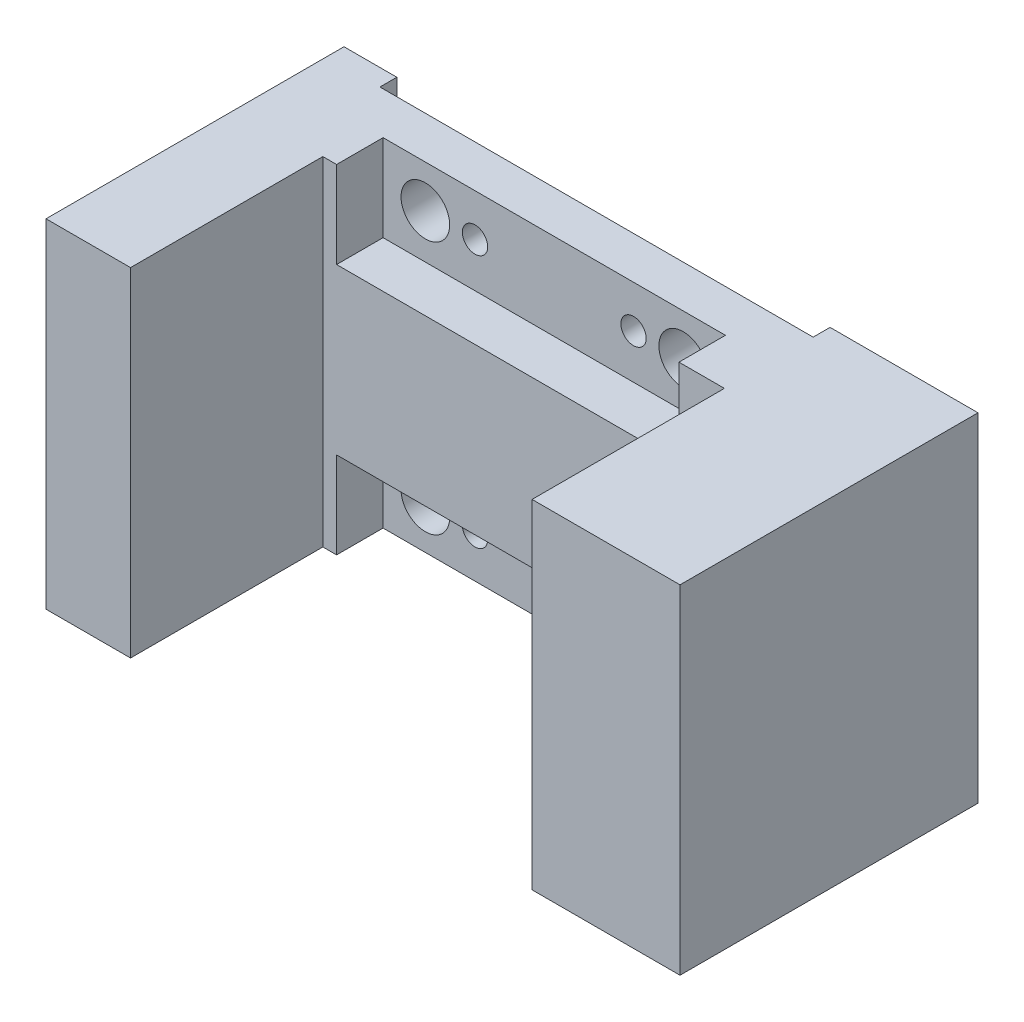
ISO-10303-21;
HEADER;
FILE_DESCRIPTION(('STEP AP214'),'2;1');
FILE_NAME('part.step','',(''),(''),'','','');
FILE_SCHEMA(('AUTOMOTIVE_DESIGN { 1 0 10303 214 1 1 1 1 }'));
ENDSEC;
DATA;
#1=APPLICATION_CONTEXT('core data for automotive mechanical design processes');
#2=APPLICATION_PROTOCOL_DEFINITION('international standard','automotive_design',2000,#1);
#3=PRODUCT_CONTEXT('',#1,'mechanical');
#4=PRODUCT('Part','Part','',(#3));
#5=PRODUCT_RELATED_PRODUCT_CATEGORY('part','',(#4));
#6=PRODUCT_DEFINITION_FORMATION('','',#4);
#7=PRODUCT_DEFINITION_CONTEXT('part definition',#1,'design');
#8=PRODUCT_DEFINITION('design','',#6,#7);
#9=PRODUCT_DEFINITION_SHAPE('','',#8);
#10=(LENGTH_UNIT() NAMED_UNIT(*) SI_UNIT(.MILLI.,.METRE.));
#11=(NAMED_UNIT(*) PLANE_ANGLE_UNIT() SI_UNIT($,.RADIAN.));
#12=(NAMED_UNIT(*) SI_UNIT($,.STERADIAN.) SOLID_ANGLE_UNIT());
#13=UNCERTAINTY_MEASURE_WITH_UNIT(LENGTH_MEASURE(1.E-05),#10,'distance_accuracy_value','');
#14=(GEOMETRIC_REPRESENTATION_CONTEXT(3) GLOBAL_UNCERTAINTY_ASSIGNED_CONTEXT((#13)) GLOBAL_UNIT_ASSIGNED_CONTEXT((#10,
#11,#12)) REPRESENTATION_CONTEXT('',''));
#15=CARTESIAN_POINT('',(0.,0.,0.));
#16=DIRECTION('',(0.,0.,1.));
#17=DIRECTION('',(1.,0.,0.));
#18=AXIS2_PLACEMENT_3D('',#15,#16,#17);
#19=CARTESIAN_POINT('',(13.2997289735968,0.736434108527126,5.8));
#20=DIRECTION('',(1.,0.,0.));
#21=DIRECTION('',(0.,0.,-1.));
#22=AXIS2_PLACEMENT_3D('',#19,#20,#21);
#23=PLANE('',#22);
#24=DIRECTION('',(0.,1.,0.));
#25=VECTOR('',#24,1.);
#26=CARTESIAN_POINT('',(13.2997289735968,0.736434108527122,2.8));
#27=LINE('',#26,#25);
#28=CARTESIAN_POINT('',(13.2997289735968,0.736434108527122,2.8));
#29=VERTEX_POINT('',#28);
#30=CARTESIAN_POINT('',(13.2997289735968,4.83643410852712,2.8));
#31=VERTEX_POINT('',#30);
#32=EDGE_CURVE('E185',#29,#31,#27,.T.);
#33=ORIENTED_EDGE('',*,*,#32,.F.);
#34=DIRECTION('',(0.,0.,-1.));
#35=VECTOR('',#34,1.);
#36=CARTESIAN_POINT('',(13.2997289735968,0.736434108527124,20.));
#37=LINE('',#36,#35);
#38=CARTESIAN_POINT('',(13.2997289735968,0.736434108527126,5.));
#39=VERTEX_POINT('',#38);
#40=EDGE_CURVE('E11',#39,#29,#37,.T.);
#41=ORIENTED_EDGE('',*,*,#40,.F.);
#42=DIRECTION('',(0.,1.,0.));
#43=VECTOR('',#42,1.);
#44=CARTESIAN_POINT('',(13.2997289735968,0.,5.));
#45=LINE('',#44,#43);
#46=CARTESIAN_POINT('',(13.2997289735968,4.83643410852712,5.));
#47=VERTEX_POINT('',#46);
#48=EDGE_CURVE('E358',#39,#47,#45,.T.);
#49=ORIENTED_EDGE('',*,*,#48,.T.);
#50=DIRECTION('',(0.,0.,-1.));
#51=VECTOR('',#50,1.);
#52=CARTESIAN_POINT('',(13.2997289735968,4.83643410852712,5.8));
#53=LINE('',#52,#51);
#54=EDGE_CURVE('E195',#47,#31,#53,.T.);
#55=ORIENTED_EDGE('',*,*,#54,.T.);
#56=EDGE_LOOP('',(#33,#41,#49,#55));
#57=FACE_BOUND('',#56,.T.);
#58=ADVANCED_FACE('F39',(#57),#23,.F.);
#59=CARTESIAN_POINT('',(-2.90027102640321,4.83643410852713,5.8));
#60=DIRECTION('',(0.,1.,0.));
#61=DIRECTION('',(-1.,0.,0.));
#62=AXIS2_PLACEMENT_3D('',#59,#60,#61);
#63=PLANE('',#62);
#64=DIRECTION('',(-1.,0.,0.));
#65=VECTOR('',#64,1.);
#66=CARTESIAN_POINT('',(-2.90027102640321,4.83643410852713,2.8));
#67=LINE('',#66,#65);
#68=CARTESIAN_POINT('',(-2.90027102640321,4.83643410852713,2.8));
#69=VERTEX_POINT('',#68);
#70=EDGE_CURVE('E189',#31,#69,#67,.T.);
#71=ORIENTED_EDGE('',*,*,#70,.F.);
#72=ORIENTED_EDGE('',*,*,#54,.F.);
#73=DIRECTION('',(-1.,0.,0.));
#74=VECTOR('',#73,1.);
#75=CARTESIAN_POINT('',(0.,4.83643410852713,5.));
#76=LINE('',#75,#74);
#77=CARTESIAN_POINT('',(-2.90027102640321,4.83643410852713,5.));
#78=VERTEX_POINT('',#77);
#79=EDGE_CURVE('E360',#47,#78,#76,.T.);
#80=ORIENTED_EDGE('',*,*,#79,.T.);
#81=DIRECTION('',(0.,0.,-1.));
#82=VECTOR('',#81,1.);
#83=CARTESIAN_POINT('',(-2.90027102640321,4.83643410852713,5.8));
#84=LINE('',#83,#82);
#85=EDGE_CURVE('E351',#78,#69,#84,.T.);
#86=ORIENTED_EDGE('',*,*,#85,.T.);
#87=EDGE_LOOP('',(#71,#72,#80,#86));
#88=FACE_BOUND('',#87,.T.);
#89=ADVANCED_FACE('F462',(#88),#63,.F.);
#90=CARTESIAN_POINT('',(-2.90027102640321,0.736434108527126,5.8));
#91=DIRECTION('',(-1.,0.,0.));
#92=DIRECTION('',(0.,-1.,0.));
#93=AXIS2_PLACEMENT_3D('',#90,#91,#92);
#94=PLANE('',#93);
#95=DIRECTION('',(0.,1.,0.));
#96=VECTOR('',#95,1.);
#97=CARTESIAN_POINT('',(-2.90027102640321,0.736434108527128,2.8));
#98=LINE('',#97,#96);
#99=CARTESIAN_POINT('',(-2.90027102640321,0.736434108527125,2.8));
#100=VERTEX_POINT('',#99);
#101=EDGE_CURVE('E56',#100,#69,#98,.T.);
#102=ORIENTED_EDGE('',*,*,#101,.T.);
#103=ORIENTED_EDGE('',*,*,#85,.F.);
#104=DIRECTION('',(0.,-1.,0.));
#105=VECTOR('',#104,1.);
#106=CARTESIAN_POINT('',(-2.90027102640321,0.,5.));
#107=LINE('',#106,#105);
#108=CARTESIAN_POINT('',(-2.90027102640321,0.736434108527125,5.));
#109=VERTEX_POINT('',#108);
#110=EDGE_CURVE('E353',#78,#109,#107,.T.);
#111=ORIENTED_EDGE('',*,*,#110,.T.);
#112=DIRECTION('',(0.,0.,1.));
#113=VECTOR('',#112,1.);
#114=CARTESIAN_POINT('',(-2.90027102640321,0.736434108527125,20.));
#115=LINE('',#114,#113);
#116=EDGE_CURVE('E48',#100,#109,#115,.T.);
#117=ORIENTED_EDGE('',*,*,#116,.F.);
#118=EDGE_LOOP('',(#102,#103,#111,#117));
#119=FACE_BOUND('',#118,.T.);
#120=ADVANCED_FACE('F466',(#119),#94,.F.);
#121=CARTESIAN_POINT('',(-2.90027102640321,16.7364341085271,5.8));
#122=DIRECTION('',(-1.,0.,0.));
#123=DIRECTION('',(0.,-1.,0.));
#124=AXIS2_PLACEMENT_3D('',#121,#122,#123);
#125=PLANE('',#124);
#126=DIRECTION('',(0.,-1.,0.));
#127=VECTOR('',#126,1.);
#128=CARTESIAN_POINT('',(-2.90027102640321,16.7364341085271,2.8));
#129=LINE('',#128,#127);
#130=CARTESIAN_POINT('',(-2.90027102640321,16.7364341085271,2.8));
#131=VERTEX_POINT('',#130);
#132=CARTESIAN_POINT('',(-2.90027102640321,12.6364341085271,2.8));
#133=VERTEX_POINT('',#132);
#134=EDGE_CURVE('E64',#131,#133,#129,.T.);
#135=ORIENTED_EDGE('',*,*,#134,.F.);
#136=DIRECTION('',(0.,0.,-1.));
#137=VECTOR('',#136,1.);
#138=CARTESIAN_POINT('',(-2.90027102640321,16.7364341085271,5.8));
#139=LINE('',#138,#137);
#140=CARTESIAN_POINT('',(-2.90027102640321,16.7364341085271,5.));
#141=VERTEX_POINT('',#140);
#142=EDGE_CURVE('E362',#141,#131,#139,.T.);
#143=ORIENTED_EDGE('',*,*,#142,.F.);
#144=DIRECTION('',(0.,-1.,0.));
#145=VECTOR('',#144,1.);
#146=CARTESIAN_POINT('',(-2.90027102640321,0.,5.));
#147=LINE('',#146,#145);
#148=CARTESIAN_POINT('',(-2.90027102640321,12.6364341085271,5.));
#149=VERTEX_POINT('',#148);
#150=EDGE_CURVE('E375',#141,#149,#147,.T.);
#151=ORIENTED_EDGE('',*,*,#150,.T.);
#152=DIRECTION('',(0.,0.,-1.));
#153=VECTOR('',#152,1.);
#154=CARTESIAN_POINT('',(-2.90027102640321,12.6364341085271,5.8));
#155=LINE('',#154,#153);
#156=EDGE_CURVE('E363',#149,#133,#155,.T.);
#157=ORIENTED_EDGE('',*,*,#156,.T.);
#158=EDGE_LOOP('',(#135,#143,#151,#157));
#159=FACE_BOUND('',#158,.T.);
#160=ADVANCED_FACE('F472',(#159),#125,.F.);
#161=CARTESIAN_POINT('',(-2.90027102640321,12.6364341085271,5.8));
#162=DIRECTION('',(0.,-1.,0.));
#163=DIRECTION('',(1.,0.,0.));
#164=AXIS2_PLACEMENT_3D('',#161,#162,#163);
#165=PLANE('',#164);
#166=DIRECTION('',(1.,0.,0.));
#167=VECTOR('',#166,1.);
#168=CARTESIAN_POINT('',(-2.90027102640321,12.6364341085271,2.8));
#169=LINE('',#168,#167);
#170=CARTESIAN_POINT('',(13.2997289735968,12.6364341085271,2.8));
#171=VERTEX_POINT('',#170);
#172=EDGE_CURVE('E196',#133,#171,#169,.T.);
#173=ORIENTED_EDGE('',*,*,#172,.F.);
#174=ORIENTED_EDGE('',*,*,#156,.F.);
#175=DIRECTION('',(1.,0.,0.));
#176=VECTOR('',#175,1.);
#177=CARTESIAN_POINT('',(0.,12.6364341085271,5.));
#178=LINE('',#177,#176);
#179=CARTESIAN_POINT('',(13.2997289735968,12.6364341085271,5.));
#180=VERTEX_POINT('',#179);
#181=EDGE_CURVE('E373',#149,#180,#178,.T.);
#182=ORIENTED_EDGE('',*,*,#181,.T.);
#183=DIRECTION('',(0.,0.,-1.));
#184=VECTOR('',#183,1.);
#185=CARTESIAN_POINT('',(13.2997289735968,12.6364341085271,5.8));
#186=LINE('',#185,#184);
#187=EDGE_CURVE('E366',#180,#171,#186,.T.);
#188=ORIENTED_EDGE('',*,*,#187,.T.);
#189=EDGE_LOOP('',(#173,#174,#182,#188));
#190=FACE_BOUND('',#189,.T.);
#191=ADVANCED_FACE('F444',(#190),#165,.F.);
#192=CARTESIAN_POINT('',(13.2997289735968,16.7364341085271,5.8));
#193=DIRECTION('',(1.,0.,0.));
#194=DIRECTION('',(0.,1.,0.));
#195=AXIS2_PLACEMENT_3D('',#192,#193,#194);
#196=PLANE('',#195);
#197=DIRECTION('',(0.,-1.,0.));
#198=VECTOR('',#197,1.);
#199=CARTESIAN_POINT('',(13.2997289735968,16.7364341085271,2.8));
#200=LINE('',#199,#198);
#201=CARTESIAN_POINT('',(13.2997289735968,16.7364341085271,2.8));
#202=VERTEX_POINT('',#201);
#203=EDGE_CURVE('E346',#202,#171,#200,.T.);
#204=ORIENTED_EDGE('',*,*,#203,.T.);
#205=ORIENTED_EDGE('',*,*,#187,.F.);
#206=DIRECTION('',(0.,1.,0.));
#207=VECTOR('',#206,1.);
#208=CARTESIAN_POINT('',(13.2997289735968,0.,5.));
#209=LINE('',#208,#207);
#210=CARTESIAN_POINT('',(13.2997289735968,16.7364341085271,5.));
#211=VERTEX_POINT('',#210);
#212=EDGE_CURVE('E365',#180,#211,#209,.T.);
#213=ORIENTED_EDGE('',*,*,#212,.T.);
#214=DIRECTION('',(0.,0.,-1.));
#215=VECTOR('',#214,1.);
#216=CARTESIAN_POINT('',(13.2997289735968,16.7364341085271,5.8));
#217=LINE('',#216,#215);
#218=EDGE_CURVE('E369',#211,#202,#217,.T.);
#219=ORIENTED_EDGE('',*,*,#218,.T.);
#220=EDGE_LOOP('',(#204,#205,#213,#219));
#221=FACE_BOUND('',#220,.T.);
#222=ADVANCED_FACE('F441',(#221),#196,.F.);
#223=CARTESIAN_POINT('',(0.,0.,0.));
#224=DIRECTION('',(0.,0.,1.));
#225=DIRECTION('',(1.,0.,0.));
#226=AXIS2_PLACEMENT_3D('',#223,#224,#225);
#227=PLANE('',#226);
#228=DIRECTION('',(1.,0.,0.));
#229=VECTOR('',#228,1.);
#230=CARTESIAN_POINT('',(-7.55027102640321,0.736434108527126,0.));
#231=LINE('',#230,#229);
#232=CARTESIAN_POINT('',(15.4497289735968,0.736434108527123,0.));
#233=VERTEX_POINT('',#232);
#234=CARTESIAN_POINT('',(22.4497289735968,0.736434108527122,0.));
#235=VERTEX_POINT('',#234);
#236=EDGE_CURVE('E383',#233,#235,#231,.T.);
#237=ORIENTED_EDGE('',*,*,#236,.F.);
#238=DIRECTION('',(0.,-1.,0.));
#239=VECTOR('',#238,1.);
#240=CARTESIAN_POINT('',(15.4497289735968,16.7364341085271,0.));
#241=LINE('',#240,#239);
#242=CARTESIAN_POINT('',(15.4497289735968,16.7364341085271,0.));
#243=VERTEX_POINT('',#242);
#244=EDGE_CURVE('E263',#243,#233,#241,.T.);
#245=ORIENTED_EDGE('',*,*,#244,.F.);
#246=DIRECTION('',(-1.,0.,0.));
#247=VECTOR('',#246,1.);
#248=CARTESIAN_POINT('',(-7.55027102640321,16.7364341085271,0.));
#249=LINE('',#248,#247);
#250=CARTESIAN_POINT('',(22.4497289735968,16.7364341085271,0.));
#251=VERTEX_POINT('',#250);
#252=EDGE_CURVE('E282',#251,#243,#249,.T.);
#253=ORIENTED_EDGE('',*,*,#252,.F.);
#254=DIRECTION('',(0.,1.,0.));
#255=VECTOR('',#254,1.);
#256=CARTESIAN_POINT('',(22.4497289735968,16.7364341085271,0.));
#257=LINE('',#256,#255);
#258=EDGE_CURVE('E279',#235,#251,#257,.T.);
#259=ORIENTED_EDGE('',*,*,#258,.F.);
#260=EDGE_LOOP('',(#237,#245,#253,#259));
#261=FACE_BOUND('',#260,.T.);
#262=ADVANCED_FACE('F419',(#261),#227,.F.);
#263=CARTESIAN_POINT('',(0.,0.,5.));
#264=DIRECTION('',(0.,0.,1.));
#265=DIRECTION('',(1.,0.,0.));
#266=AXIS2_PLACEMENT_3D('',#263,#264,#265);
#267=PLANE('',#266);
#268=ORIENTED_EDGE('',*,*,#48,.F.);
#269=DIRECTION('',(-1.,0.,0.));
#270=VECTOR('',#269,1.);
#271=CARTESIAN_POINT('',(0.,0.736434108527125,5.));
#272=LINE('',#271,#270);
#273=CARTESIAN_POINT('',(15.4497289735968,0.736434108527122,5.));
#274=VERTEX_POINT('',#273);
#275=EDGE_CURVE('E202',#274,#39,#272,.T.);
#276=ORIENTED_EDGE('',*,*,#275,.F.);
#277=DIRECTION('',(0.,1.,0.));
#278=VECTOR('',#277,1.);
#279=CARTESIAN_POINT('',(15.4497289735968,16.7364341085271,5.));
#280=LINE('',#279,#278);
#281=CARTESIAN_POINT('',(15.4497289735968,16.7364341085271,5.));
#282=VERTEX_POINT('',#281);
#283=EDGE_CURVE('E239',#274,#282,#280,.T.);
#284=ORIENTED_EDGE('',*,*,#283,.T.);
#285=DIRECTION('',(-1.,0.,0.));
#286=VECTOR('',#285,1.);
#287=CARTESIAN_POINT('',(-7.55027102640321,16.7364341085271,5.));
#288=LINE('',#287,#286);
#289=EDGE_CURVE('E242',#282,#211,#288,.T.);
#290=ORIENTED_EDGE('',*,*,#289,.T.);
#291=ORIENTED_EDGE('',*,*,#212,.F.);
#292=ORIENTED_EDGE('',*,*,#181,.F.);
#293=ORIENTED_EDGE('',*,*,#150,.F.);
#294=CARTESIAN_POINT('',(-3.55027102640321,16.7364341085271,5.));
#295=VERTEX_POINT('',#294);
#296=EDGE_CURVE('E241',#141,#295,#288,.T.);
#297=ORIENTED_EDGE('',*,*,#296,.T.);
#298=DIRECTION('',(0.,1.,0.));
#299=VECTOR('',#298,1.);
#300=CARTESIAN_POINT('',(-3.55027102640321,16.7364341085271,5.));
#301=LINE('',#300,#299);
#302=CARTESIAN_POINT('',(-3.55027102640321,0.736434108527125,5.));
#303=VERTEX_POINT('',#302);
#304=EDGE_CURVE('E225',#303,#295,#301,.T.);
#305=ORIENTED_EDGE('',*,*,#304,.F.);
#306=EDGE_CURVE('E208',#109,#303,#272,.T.);
#307=ORIENTED_EDGE('',*,*,#306,.F.);
#308=ORIENTED_EDGE('',*,*,#110,.F.);
#309=ORIENTED_EDGE('',*,*,#79,.F.);
#310=EDGE_LOOP('',(#268,#276,#284,#290,#291,#292,#293,#297,#305,#307,#308,#309));
#311=FACE_BOUND('',#310,.T.);
#312=ADVANCED_FACE('F434',(#311),#267,.T.);
#313=CARTESIAN_POINT('',(-7.55027102640321,16.7364341085271,10.));
#314=DIRECTION('',(1.,0.,0.));
#315=DIRECTION('',(0.,1.,0.));
#316=AXIS2_PLACEMENT_3D('',#313,#314,#315);
#317=PLANE('',#316);
#318=DIRECTION('',(0.,-1.,0.));
#319=VECTOR('',#318,1.);
#320=CARTESIAN_POINT('',(-7.55027102640321,16.7364341085271,0.));
#321=LINE('',#320,#319);
#322=CARTESIAN_POINT('',(-7.55027102640321,16.7364341085271,0.));
#323=VERTEX_POINT('',#322);
#324=CARTESIAN_POINT('',(-7.55027102640321,0.736434108527126,0.));
#325=VERTEX_POINT('',#324);
#326=EDGE_CURVE('E274',#323,#325,#321,.T.);
#327=ORIENTED_EDGE('',*,*,#326,.T.);
#328=DIRECTION('',(0.,0.,-1.));
#329=VECTOR('',#328,1.);
#330=CARTESIAN_POINT('',(-7.55027102640321,0.736434108527126,20.));
#331=LINE('',#330,#329);
#332=CARTESIAN_POINT('',(-7.55027102640321,0.736434108527126,14.1));
#333=VERTEX_POINT('',#332);
#334=EDGE_CURVE('E387',#333,#325,#331,.T.);
#335=ORIENTED_EDGE('',*,*,#334,.F.);
#336=DIRECTION('',(0.,-1.,0.));
#337=VECTOR('',#336,1.);
#338=CARTESIAN_POINT('',(-7.55027102640321,16.7364341085271,14.1));
#339=LINE('',#338,#337);
#340=CARTESIAN_POINT('',(-7.55027102640321,16.7364341085271,14.1));
#341=VERTEX_POINT('',#340);
#342=EDGE_CURVE('E226',#341,#333,#339,.T.);
#343=ORIENTED_EDGE('',*,*,#342,.F.);
#344=DIRECTION('',(0.,0.,-1.));
#345=VECTOR('',#344,1.);
#346=CARTESIAN_POINT('',(-7.55027102640321,16.7364341085271,10.));
#347=LINE('',#346,#345);
#348=EDGE_CURVE('E285',#341,#323,#347,.T.);
#349=ORIENTED_EDGE('',*,*,#348,.T.);
#350=EDGE_LOOP('',(#327,#335,#343,#349));
#351=FACE_BOUND('',#350,.T.);
#352=ADVANCED_FACE('F41',(#351),#317,.F.);
#353=CARTESIAN_POINT('',(22.4497289735968,16.7364341085271,10.));
#354=DIRECTION('',(-1.,0.,0.));
#355=DIRECTION('',(0.,-1.,0.));
#356=AXIS2_PLACEMENT_3D('',#353,#354,#355);
#357=PLANE('',#356);
#358=DIRECTION('',(0.,1.,0.));
#359=VECTOR('',#358,1.);
#360=CARTESIAN_POINT('',(22.4497289735968,16.7364341085271,14.1));
#361=LINE('',#360,#359);
#362=CARTESIAN_POINT('',(22.4497289735968,0.736434108527122,14.1));
#363=VERTEX_POINT('',#362);
#364=CARTESIAN_POINT('',(22.4497289735968,16.7364341085271,14.1));
#365=VERTEX_POINT('',#364);
#366=EDGE_CURVE('E220',#363,#365,#361,.T.);
#367=ORIENTED_EDGE('',*,*,#366,.F.);
#368=DIRECTION('',(0.,0.,-1.));
#369=VECTOR('',#368,1.);
#370=CARTESIAN_POINT('',(22.4497289735968,0.736434108527122,20.));
#371=LINE('',#370,#369);
#372=EDGE_CURVE('E388',#363,#235,#371,.T.);
#373=ORIENTED_EDGE('',*,*,#372,.T.);
#374=ORIENTED_EDGE('',*,*,#258,.T.);
#375=DIRECTION('',(0.,0.,-1.));
#376=VECTOR('',#375,1.);
#377=CARTESIAN_POINT('',(22.4497289735968,16.7364341085271,10.));
#378=LINE('',#377,#376);
#379=EDGE_CURVE('E287',#365,#251,#378,.T.);
#380=ORIENTED_EDGE('',*,*,#379,.F.);
#381=EDGE_LOOP('',(#367,#373,#374,#380));
#382=FACE_BOUND('',#381,.T.);
#383=ADVANCED_FACE('F425',(#382),#357,.F.);
#384=CARTESIAN_POINT('',(-7.55027102640321,16.7364341085271,10.));
#385=DIRECTION('',(0.,-1.,0.));
#386=DIRECTION('',(0.,0.,-1.));
#387=AXIS2_PLACEMENT_3D('',#384,#385,#386);
#388=PLANE('',#387);
#389=DIRECTION('',(0.,0.,-1.));
#390=VECTOR('',#389,1.);
#391=CARTESIAN_POINT('',(15.4497289735968,16.7364341085271,0.8));
#392=LINE('',#391,#390);
#393=CARTESIAN_POINT('',(15.4497289735968,16.7364341085271,0.8));
#394=VERTEX_POINT('',#393);
#395=EDGE_CURVE('E272',#394,#243,#392,.T.);
#396=ORIENTED_EDGE('',*,*,#395,.F.);
#397=DIRECTION('',(1.,0.,0.));
#398=VECTOR('',#397,1.);
#399=CARTESIAN_POINT('',(-5.05027102640321,16.7364341085271,0.8));
#400=LINE('',#399,#398);
#401=CARTESIAN_POINT('',(-5.05027102640321,16.7364341085271,0.8));
#402=VERTEX_POINT('',#401);
#403=EDGE_CURVE('E262',#402,#394,#400,.T.);
#404=ORIENTED_EDGE('',*,*,#403,.F.);
#405=DIRECTION('',(0.,0.,-1.));
#406=VECTOR('',#405,1.);
#407=CARTESIAN_POINT('',(-5.05027102640321,16.7364341085271,0.8));
#408=LINE('',#407,#406);
#409=CARTESIAN_POINT('',(-5.05027102640321,16.7364341085271,0.));
#410=VERTEX_POINT('',#409);
#411=EDGE_CURVE('E269',#402,#410,#408,.T.);
#412=ORIENTED_EDGE('',*,*,#411,.T.);
#413=EDGE_CURVE('E281',#410,#323,#249,.T.);
#414=ORIENTED_EDGE('',*,*,#413,.T.);
#415=ORIENTED_EDGE('',*,*,#348,.F.);
#416=DIRECTION('',(-1.,0.,0.));
#417=VECTOR('',#416,1.);
#418=CARTESIAN_POINT('',(-7.55027102640321,16.7364341085271,14.1));
#419=LINE('',#418,#417);
#420=CARTESIAN_POINT('',(-3.55027102640321,16.7364341085271,14.1));
#421=VERTEX_POINT('',#420);
#422=EDGE_CURVE('E231',#421,#341,#419,.T.);
#423=ORIENTED_EDGE('',*,*,#422,.F.);
#424=DIRECTION('',(0.,0.,-1.));
#425=VECTOR('',#424,1.);
#426=CARTESIAN_POINT('',(-3.55027102640321,16.7364341085271,14.1));
#427=LINE('',#426,#425);
#428=EDGE_CURVE('E234',#421,#295,#427,.T.);
#429=ORIENTED_EDGE('',*,*,#428,.T.);
#430=ORIENTED_EDGE('',*,*,#296,.F.);
#431=ORIENTED_EDGE('',*,*,#142,.T.);
#432=DIRECTION('',(1.,0.,0.));
#433=VECTOR('',#432,1.);
#434=CARTESIAN_POINT('',(-2.90027102640321,16.7364341085271,2.8));
#435=LINE('',#434,#433);
#436=EDGE_CURVE('E343',#131,#202,#435,.T.);
#437=ORIENTED_EDGE('',*,*,#436,.T.);
#438=ORIENTED_EDGE('',*,*,#218,.F.);
#439=ORIENTED_EDGE('',*,*,#289,.F.);
#440=DIRECTION('',(0.,0.,1.));
#441=VECTOR('',#440,1.);
#442=CARTESIAN_POINT('',(15.4497289735968,16.7364341085271,5.));
#443=LINE('',#442,#441);
#444=CARTESIAN_POINT('',(15.4497289735968,16.7364341085271,14.1));
#445=VERTEX_POINT('',#444);
#446=EDGE_CURVE('E245',#282,#445,#443,.T.);
#447=ORIENTED_EDGE('',*,*,#446,.T.);
#448=DIRECTION('',(-1.,0.,0.));
#449=VECTOR('',#448,1.);
#450=CARTESIAN_POINT('',(15.4497289735968,16.7364341085271,14.1));
#451=LINE('',#450,#449);
#452=EDGE_CURVE('E222',#365,#445,#451,.T.);
#453=ORIENTED_EDGE('',*,*,#452,.F.);
#454=ORIENTED_EDGE('',*,*,#379,.T.);
#455=ORIENTED_EDGE('',*,*,#252,.T.);
#456=EDGE_LOOP('',(#396,#404,#412,#414,#415,#423,#429,#430,#431,#437,#438,#439,#447,#453,#454,#455));
#457=FACE_BOUND('',#456,.T.);
#458=ADVANCED_FACE('F403',(#457),#388,.F.);
#459=DIRECTION('',(0.,1.,0.));
#460=VECTOR('',#459,1.);
#461=CARTESIAN_POINT('',(-5.05027102640321,16.7364341085271,0.));
#462=LINE('',#461,#460);
#463=CARTESIAN_POINT('',(-5.05027102640321,0.736434108527126,0.));
#464=VERTEX_POINT('',#463);
#465=EDGE_CURVE('E259',#464,#410,#462,.T.);
#466=ORIENTED_EDGE('',*,*,#465,.F.);
#467=EDGE_CURVE('E384',#325,#464,#231,.T.);
#468=ORIENTED_EDGE('',*,*,#467,.F.);
#469=ORIENTED_EDGE('',*,*,#326,.F.);
#470=ORIENTED_EDGE('',*,*,#413,.F.);
#471=EDGE_LOOP('',(#466,#468,#469,#470));
#472=FACE_BOUND('',#471,.T.);
#473=ADVANCED_FACE('F397',(#472),#227,.F.);
#474=CARTESIAN_POINT('',(-5.05027102640321,16.7364341085271,0.8));
#475=DIRECTION('',(-1.,0.,0.));
#476=DIRECTION('',(0.,-1.,0.));
#477=AXIS2_PLACEMENT_3D('',#474,#475,#476);
#478=PLANE('',#477);
#479=ORIENTED_EDGE('',*,*,#465,.T.);
#480=ORIENTED_EDGE('',*,*,#411,.F.);
#481=DIRECTION('',(0.,1.,0.));
#482=VECTOR('',#481,1.);
#483=CARTESIAN_POINT('',(-5.05027102640321,16.7364341085271,0.8));
#484=LINE('',#483,#482);
#485=CARTESIAN_POINT('',(-5.05027102640321,0.736434108527126,0.8));
#486=VERTEX_POINT('',#485);
#487=EDGE_CURVE('E260',#486,#402,#484,.T.);
#488=ORIENTED_EDGE('',*,*,#487,.F.);
#489=DIRECTION('',(0.,0.,-1.));
#490=VECTOR('',#489,1.);
#491=CARTESIAN_POINT('',(-5.05027102640321,0.736434108527126,0.));
#492=LINE('',#491,#490);
#493=EDGE_CURVE('E380',#486,#464,#492,.T.);
#494=ORIENTED_EDGE('',*,*,#493,.T.);
#495=EDGE_LOOP('',(#479,#480,#488,#494));
#496=FACE_BOUND('',#495,.T.);
#497=ADVANCED_FACE('F408',(#496),#478,.F.);
#498=CARTESIAN_POINT('',(15.4497289735968,16.7364341085271,0.8));
#499=DIRECTION('',(1.,0.,0.));
#500=DIRECTION('',(0.,1.,0.));
#501=AXIS2_PLACEMENT_3D('',#498,#499,#500);
#502=PLANE('',#501);
#503=DIRECTION('',(0.,0.,1.));
#504=VECTOR('',#503,1.);
#505=CARTESIAN_POINT('',(15.4497289735968,0.736434108527123,0.));
#506=LINE('',#505,#504);
#507=CARTESIAN_POINT('',(15.4497289735968,0.736434108527123,0.800000000000004));
#508=VERTEX_POINT('',#507);
#509=EDGE_CURVE('E377',#233,#508,#506,.T.);
#510=ORIENTED_EDGE('',*,*,#509,.T.);
#511=DIRECTION('',(0.,-1.,0.));
#512=VECTOR('',#511,1.);
#513=CARTESIAN_POINT('',(15.4497289735968,16.7364341085271,0.8));
#514=LINE('',#513,#512);
#515=EDGE_CURVE('E265',#394,#508,#514,.T.);
#516=ORIENTED_EDGE('',*,*,#515,.F.);
#517=ORIENTED_EDGE('',*,*,#395,.T.);
#518=ORIENTED_EDGE('',*,*,#244,.T.);
#519=EDGE_LOOP('',(#510,#516,#517,#518));
#520=FACE_BOUND('',#519,.T.);
#521=ADVANCED_FACE('F415',(#520),#502,.F.);
#522=CARTESIAN_POINT('',(-2.05027102640321,3.73643410852713,0.8));
#523=DIRECTION('',(0.,0.,-1.));
#524=DIRECTION('',(-1.,0.,0.));
#525=AXIS2_PLACEMENT_3D('',#522,#523,#524);
#526=PLANE('',#525);
#527=CARTESIAN_POINT('',(-0.900271026403209,2.73643410852713,0.8));
#528=DIRECTION('',(0.,0.,-1.));
#529=DIRECTION('',(1.,0.,0.));
#530=AXIS2_PLACEMENT_3D('',#527,#528,#529);
#531=CIRCLE('',#530,1.15);
#532=CARTESIAN_POINT('',(0.249728973596791,2.73643410852713,0.8));
#533=VERTEX_POINT('',#532);
#534=EDGE_CURVE('E328',#533,#533,#531,.T.);
#535=ORIENTED_EDGE('',*,*,#534,.F.);
#536=EDGE_LOOP('',(#535));
#537=FACE_BOUND('',#536,.T.);
#538=CARTESIAN_POINT('',(11.2997289735968,2.73643410852713,0.8));
#539=DIRECTION('',(0.,0.,-1.));
#540=DIRECTION('',(1.,0.,0.));
#541=AXIS2_PLACEMENT_3D('',#538,#539,#540);
#542=CIRCLE('',#541,1.15);
#543=CARTESIAN_POINT('',(12.4497289735968,2.73643410852713,0.8));
#544=VERTEX_POINT('',#543);
#545=EDGE_CURVE('E318',#544,#544,#542,.T.);
#546=ORIENTED_EDGE('',*,*,#545,.F.);
#547=EDGE_LOOP('',(#546));
#548=FACE_BOUND('',#547,.T.);
#549=CARTESIAN_POINT('',(1.44972897359679,2.73643410852713,0.8));
#550=DIRECTION('',(0.,0.,-1.));
#551=DIRECTION('',(1.,0.,0.));
#552=AXIS2_PLACEMENT_3D('',#549,#550,#551);
#553=CIRCLE('',#552,0.6);
#554=CARTESIAN_POINT('',(2.04972897359679,2.73643410852713,0.8));
#555=VERTEX_POINT('',#554);
#556=EDGE_CURVE('E315',#555,#555,#553,.T.);
#557=ORIENTED_EDGE('',*,*,#556,.F.);
#558=EDGE_LOOP('',(#557));
#559=FACE_BOUND('',#558,.T.);
#560=CARTESIAN_POINT('',(8.94972897359679,2.73643410852713,0.8));
#561=DIRECTION('',(0.,0.,-1.));
#562=DIRECTION('',(1.,0.,0.));
#563=AXIS2_PLACEMENT_3D('',#560,#561,#562);
#564=CIRCLE('',#563,0.6);
#565=CARTESIAN_POINT('',(9.54972897359679,2.73643410852713,0.8));
#566=VERTEX_POINT('',#565);
#567=EDGE_CURVE('E312',#566,#566,#564,.T.);
#568=ORIENTED_EDGE('',*,*,#567,.F.);
#569=EDGE_LOOP('',(#568));
#570=FACE_BOUND('',#569,.T.);
#571=CARTESIAN_POINT('',(8.94972897359679,14.7364341085271,0.8));
#572=DIRECTION('',(0.,0.,-1.));
#573=DIRECTION('',(-1.,0.,0.));
#574=AXIS2_PLACEMENT_3D('',#571,#572,#573);
#575=CIRCLE('',#574,0.6);
#576=CARTESIAN_POINT('',(8.34972897359679,14.7364341085271,0.8));
#577=VERTEX_POINT('',#576);
#578=EDGE_CURVE('E308',#577,#577,#575,.T.);
#579=ORIENTED_EDGE('',*,*,#578,.F.);
#580=EDGE_LOOP('',(#579));
#581=FACE_BOUND('',#580,.T.);
#582=CARTESIAN_POINT('',(1.44972897359679,14.7364341085271,0.8));
#583=DIRECTION('',(0.,0.,-1.));
#584=DIRECTION('',(-1.,0.,0.));
#585=AXIS2_PLACEMENT_3D('',#582,#583,#584);
#586=CIRCLE('',#585,0.6);
#587=CARTESIAN_POINT('',(0.849728973596791,14.7364341085271,0.8));
#588=VERTEX_POINT('',#587);
#589=EDGE_CURVE('E304',#588,#588,#586,.T.);
#590=ORIENTED_EDGE('',*,*,#589,.F.);
#591=EDGE_LOOP('',(#590));
#592=FACE_BOUND('',#591,.T.);
#593=CARTESIAN_POINT('',(11.2997289735968,14.7364341085271,0.8));
#594=DIRECTION('',(0.,0.,-1.));
#595=DIRECTION('',(-1.,0.,0.));
#596=AXIS2_PLACEMENT_3D('',#593,#594,#595);
#597=CIRCLE('',#596,1.15);
#598=CARTESIAN_POINT('',(10.1497289735968,14.7364341085271,0.8));
#599=VERTEX_POINT('',#598);
#600=EDGE_CURVE('E300',#599,#599,#597,.T.);
#601=ORIENTED_EDGE('',*,*,#600,.F.);
#602=EDGE_LOOP('',(#601));
#603=FACE_BOUND('',#602,.T.);
#604=CARTESIAN_POINT('',(-0.900271026403209,14.7364341085271,0.8));
#605=DIRECTION('',(0.,0.,-1.));
#606=DIRECTION('',(-1.,0.,0.));
#607=AXIS2_PLACEMENT_3D('',#604,#605,#606);
#608=CIRCLE('',#607,1.15);
#609=CARTESIAN_POINT('',(-2.05027102640321,14.7364341085271,0.8));
#610=VERTEX_POINT('',#609);
#611=EDGE_CURVE('E296',#610,#610,#608,.T.);
#612=ORIENTED_EDGE('',*,*,#611,.F.);
#613=EDGE_LOOP('',(#612));
#614=FACE_BOUND('',#613,.T.);
#615=DIRECTION('',(-1.,0.,0.));
#616=VECTOR('',#615,1.);
#617=CARTESIAN_POINT('',(-2.05027102640321,0.736434108527125,0.8));
#618=LINE('',#617,#616);
#619=EDGE_CURVE('E267',#508,#486,#618,.T.);
#620=ORIENTED_EDGE('',*,*,#619,.T.);
#621=ORIENTED_EDGE('',*,*,#487,.T.);
#622=ORIENTED_EDGE('',*,*,#403,.T.);
#623=ORIENTED_EDGE('',*,*,#515,.T.);
#624=EDGE_LOOP('',(#620,#621,#622,#623));
#625=FACE_BOUND('',#624,.T.);
#626=CARTESIAN_POINT('',(12.1997289735968,8.73643410852712,0.8));
#627=DIRECTION('',(0.,0.,-1.));
#628=DIRECTION('',(-1.,0.,0.));
#629=AXIS2_PLACEMENT_3D('',#626,#627,#628);
#630=CIRCLE('',#629,0.55);
#631=CARTESIAN_POINT('',(11.6497289735968,8.73643410852712,0.8));
#632=VERTEX_POINT('',#631);
#633=EDGE_CURVE('E247',#632,#632,#630,.T.);
#634=ORIENTED_EDGE('',*,*,#633,.F.);
#635=EDGE_LOOP('',(#634));
#636=FACE_BOUND('',#635,.T.);
#637=CARTESIAN_POINT('',(-1.80027102640321,8.73643410852712,0.8));
#638=DIRECTION('',(0.,0.,-1.));
#639=DIRECTION('',(-1.,0.,0.));
#640=AXIS2_PLACEMENT_3D('',#637,#638,#639);
#641=CIRCLE('',#640,0.549999999999999);
#642=CARTESIAN_POINT('',(-2.35027102640321,8.73643410852712,0.8));
#643=VERTEX_POINT('',#642);
#644=EDGE_CURVE('E253',#643,#643,#641,.T.);
#645=ORIENTED_EDGE('',*,*,#644,.F.);
#646=EDGE_LOOP('',(#645));
#647=FACE_BOUND('',#646,.T.);
#648=ADVANCED_FACE('F509',(#537,#548,#559,#570,#581,#592,#603,#614,#625,#636,#647),#526,.T.);
#649=CARTESIAN_POINT('',(-1.80027102640321,8.73643410852712,4.5));
#650=DIRECTION('',(0.,0.,-1.));
#651=DIRECTION('',(-1.,0.,0.));
#652=AXIS2_PLACEMENT_3D('',#649,#650,#651);
#653=CONICAL_SURFACE('',#652,0.549999999999999,1.02974425867665);
#654=CARTESIAN_POINT('',(-1.80027102640321,8.73643410852712,4.83047334046516));
#655=VERTEX_POINT('',#654);
#656=VERTEX_LOOP('',#655);
#657=FACE_BOUND('',#656,.T.);
#658=CARTESIAN_POINT('',(-1.80027102640321,8.73643410852712,4.5));
#659=DIRECTION('',(0.,0.,-1.));
#660=DIRECTION('',(-1.,0.,0.));
#661=AXIS2_PLACEMENT_3D('',#658,#659,#660);
#662=CIRCLE('',#661,0.549999999999999);
#663=CARTESIAN_POINT('',(-2.35027102640321,8.73643410852712,4.5));
#664=VERTEX_POINT('',#663);
#665=EDGE_CURVE('E256',#664,#664,#662,.T.);
#666=ORIENTED_EDGE('',*,*,#665,.T.);
#667=EDGE_LOOP('',(#666));
#668=FACE_BOUND('',#667,.T.);
#669=ADVANCED_FACE('F505',(#657,#668),#653,.F.);
#670=CARTESIAN_POINT('',(-1.80027102640321,8.73643410852712,0.8));
#671=DIRECTION('',(0.,0.,-1.));
#672=DIRECTION('',(-1.,0.,0.));
#673=AXIS2_PLACEMENT_3D('',#670,#671,#672);
#674=CYLINDRICAL_SURFACE('',#673,0.549999999999999);
#675=ORIENTED_EDGE('',*,*,#665,.F.);
#676=EDGE_LOOP('',(#675));
#677=FACE_BOUND('',#676,.T.);
#678=ORIENTED_EDGE('',*,*,#644,.T.);
#679=EDGE_LOOP('',(#678));
#680=FACE_BOUND('',#679,.T.);
#681=ADVANCED_FACE('F501',(#677,#680),#674,.F.);
#682=CARTESIAN_POINT('',(12.1997289735968,8.73643410852712,4.5));
#683=DIRECTION('',(0.,0.,-1.));
#684=DIRECTION('',(-1.,0.,0.));
#685=AXIS2_PLACEMENT_3D('',#682,#683,#684);
#686=CONICAL_SURFACE('',#685,0.549999999999998,1.02974425867665);
#687=CARTESIAN_POINT('',(12.1997289735968,8.73643410852712,4.83047334046516));
#688=VERTEX_POINT('',#687);
#689=VERTEX_LOOP('',#688);
#690=FACE_BOUND('',#689,.T.);
#691=CARTESIAN_POINT('',(12.1997289735968,8.73643410852712,4.5));
#692=DIRECTION('',(0.,0.,-1.));
#693=DIRECTION('',(-1.,0.,0.));
#694=AXIS2_PLACEMENT_3D('',#691,#692,#693);
#695=CIRCLE('',#694,0.549999999999998);
#696=CARTESIAN_POINT('',(11.6497289735968,8.73643410852712,4.5));
#697=VERTEX_POINT('',#696);
#698=EDGE_CURVE('E250',#697,#697,#695,.T.);
#699=ORIENTED_EDGE('',*,*,#698,.T.);
#700=EDGE_LOOP('',(#699));
#701=FACE_BOUND('',#700,.T.);
#702=ADVANCED_FACE('F497',(#690,#701),#686,.F.);
#703=CARTESIAN_POINT('',(12.1997289735968,8.73643410852712,0.8));
#704=DIRECTION('',(0.,0.,-1.));
#705=DIRECTION('',(-1.,0.,0.));
#706=AXIS2_PLACEMENT_3D('',#703,#704,#705);
#707=CYLINDRICAL_SURFACE('',#706,0.549999999999999);
#708=ORIENTED_EDGE('',*,*,#698,.F.);
#709=EDGE_LOOP('',(#708));
#710=FACE_BOUND('',#709,.T.);
#711=ORIENTED_EDGE('',*,*,#633,.T.);
#712=EDGE_LOOP('',(#711));
#713=FACE_BOUND('',#712,.T.);
#714=ADVANCED_FACE('F494',(#710,#713),#707,.F.);
#715=CARTESIAN_POINT('',(15.4497289735968,16.7364341085271,5.));
#716=DIRECTION('',(1.,0.,0.));
#717=DIRECTION('',(0.,1.,0.));
#718=AXIS2_PLACEMENT_3D('',#715,#716,#717);
#719=PLANE('',#718);
#720=ORIENTED_EDGE('',*,*,#283,.F.);
#721=DIRECTION('',(0.,0.,1.));
#722=VECTOR('',#721,1.);
#723=CARTESIAN_POINT('',(15.4497289735968,0.736434108527122,5.));
#724=LINE('',#723,#722);
#725=CARTESIAN_POINT('',(15.4497289735968,0.736434108527123,14.1));
#726=VERTEX_POINT('',#725);
#727=EDGE_CURVE('E204',#274,#726,#724,.T.);
#728=ORIENTED_EDGE('',*,*,#727,.T.);
#729=DIRECTION('',(0.,-1.,0.));
#730=VECTOR('',#729,1.);
#731=CARTESIAN_POINT('',(15.4497289735968,16.7364341085271,14.1));
#732=LINE('',#731,#730);
#733=EDGE_CURVE('E217',#445,#726,#732,.T.);
#734=ORIENTED_EDGE('',*,*,#733,.F.);
#735=ORIENTED_EDGE('',*,*,#446,.F.);
#736=EDGE_LOOP('',(#720,#728,#734,#735));
#737=FACE_BOUND('',#736,.T.);
#738=ADVANCED_FACE('F432',(#737),#719,.F.);
#739=CARTESIAN_POINT('',(-3.55027102640321,16.7364341085271,14.1));
#740=DIRECTION('',(-1.,0.,0.));
#741=DIRECTION('',(0.,-1.,0.));
#742=AXIS2_PLACEMENT_3D('',#739,#740,#741);
#743=PLANE('',#742);
#744=DIRECTION('',(0.,1.,0.));
#745=VECTOR('',#744,1.);
#746=CARTESIAN_POINT('',(-3.55027102640321,16.7364341085271,14.1));
#747=LINE('',#746,#745);
#748=CARTESIAN_POINT('',(-3.55027102640321,0.736434108527126,14.1));
#749=VERTEX_POINT('',#748);
#750=EDGE_CURVE('E229',#749,#421,#747,.T.);
#751=ORIENTED_EDGE('',*,*,#750,.F.);
#752=DIRECTION('',(0.,0.,-1.));
#753=VECTOR('',#752,1.);
#754=CARTESIAN_POINT('',(-3.55027102640321,0.736434108527126,14.1));
#755=LINE('',#754,#753);
#756=EDGE_CURVE('E207',#749,#303,#755,.T.);
#757=ORIENTED_EDGE('',*,*,#756,.T.);
#758=ORIENTED_EDGE('',*,*,#304,.T.);
#759=ORIENTED_EDGE('',*,*,#428,.F.);
#760=EDGE_LOOP('',(#751,#757,#758,#759));
#761=FACE_BOUND('',#760,.T.);
#762=ADVANCED_FACE('F485',(#761),#743,.F.);
#763=CARTESIAN_POINT('',(0.,0.,14.1));
#764=DIRECTION('',(0.,0.,1.));
#765=DIRECTION('',(1.,0.,0.));
#766=AXIS2_PLACEMENT_3D('',#763,#764,#765);
#767=PLANE('',#766);
#768=DIRECTION('',(-1.,0.,0.));
#769=VECTOR('',#768,1.);
#770=CARTESIAN_POINT('',(0.,0.736434108527125,14.1));
#771=LINE('',#770,#769);
#772=EDGE_CURVE('E211',#749,#333,#771,.T.);
#773=ORIENTED_EDGE('',*,*,#772,.F.);
#774=ORIENTED_EDGE('',*,*,#750,.T.);
#775=ORIENTED_EDGE('',*,*,#422,.T.);
#776=ORIENTED_EDGE('',*,*,#342,.T.);
#777=EDGE_LOOP('',(#773,#774,#775,#776));
#778=FACE_BOUND('',#777,.T.);
#779=ADVANCED_FACE('F482',(#778),#767,.T.);
#780=CARTESIAN_POINT('',(0.,0.,14.1));
#781=DIRECTION('',(0.,0.,1.));
#782=DIRECTION('',(1.,0.,0.));
#783=AXIS2_PLACEMENT_3D('',#780,#781,#782);
#784=PLANE('',#783);
#785=DIRECTION('',(-1.,0.,0.));
#786=VECTOR('',#785,1.);
#787=CARTESIAN_POINT('',(0.,0.736434108527125,14.1));
#788=LINE('',#787,#786);
#789=EDGE_CURVE('E290',#363,#726,#788,.T.);
#790=ORIENTED_EDGE('',*,*,#789,.F.);
#791=ORIENTED_EDGE('',*,*,#366,.T.);
#792=ORIENTED_EDGE('',*,*,#452,.T.);
#793=ORIENTED_EDGE('',*,*,#733,.T.);
#794=EDGE_LOOP('',(#790,#791,#792,#793));
#795=FACE_BOUND('',#794,.T.);
#796=ADVANCED_FACE('F428',(#795),#784,.T.);
#797=CARTESIAN_POINT('',(-7.55027102640321,0.736434108527126,20.));
#798=DIRECTION('',(0.,1.,0.));
#799=DIRECTION('',(-1.,0.,0.));
#800=AXIS2_PLACEMENT_3D('',#797,#798,#799);
#801=PLANE('',#800);
#802=ORIENTED_EDGE('',*,*,#493,.F.);
#803=ORIENTED_EDGE('',*,*,#619,.F.);
#804=ORIENTED_EDGE('',*,*,#509,.F.);
#805=ORIENTED_EDGE('',*,*,#236,.T.);
#806=ORIENTED_EDGE('',*,*,#372,.F.);
#807=ORIENTED_EDGE('',*,*,#789,.T.);
#808=ORIENTED_EDGE('',*,*,#727,.F.);
#809=ORIENTED_EDGE('',*,*,#275,.T.);
#810=ORIENTED_EDGE('',*,*,#40,.T.);
#811=DIRECTION('',(-1.,0.,0.));
#812=VECTOR('',#811,1.);
#813=CARTESIAN_POINT('',(-2.90027102640321,0.736434108527128,2.8));
#814=LINE('',#813,#812);
#815=EDGE_CURVE('E182',#29,#100,#814,.T.);
#816=ORIENTED_EDGE('',*,*,#815,.T.);
#817=ORIENTED_EDGE('',*,*,#116,.T.);
#818=ORIENTED_EDGE('',*,*,#306,.T.);
#819=ORIENTED_EDGE('',*,*,#756,.F.);
#820=ORIENTED_EDGE('',*,*,#772,.T.);
#821=ORIENTED_EDGE('',*,*,#334,.T.);
#822=ORIENTED_EDGE('',*,*,#467,.T.);
#823=EDGE_LOOP('',(#802,#803,#804,#805,#806,#807,#808,#809,#810,#816,#817,#818,#819,#820,#821,#822));
#824=FACE_BOUND('',#823,.T.);
#825=ADVANCED_FACE('F200',(#824),#801,.F.);
#826=CARTESIAN_POINT('',(-2.90027102640321,16.7364341085271,2.8));
#827=DIRECTION('',(0.,0.,-1.));
#828=DIRECTION('',(-1.,0.,0.));
#829=AXIS2_PLACEMENT_3D('',#826,#827,#828);
#830=PLANE('',#829);
#831=CARTESIAN_POINT('',(8.94972897359679,14.7364341085271,2.8));
#832=DIRECTION('',(0.,0.,-1.));
#833=DIRECTION('',(-1.,0.,0.));
#834=AXIS2_PLACEMENT_3D('',#831,#832,#833);
#835=CIRCLE('',#834,0.6);
#836=CARTESIAN_POINT('',(8.34972897359679,14.7364341085271,2.8));
#837=VERTEX_POINT('',#836);
#838=EDGE_CURVE('E305',#837,#837,#835,.T.);
#839=ORIENTED_EDGE('',*,*,#838,.T.);
#840=EDGE_LOOP('',(#839));
#841=FACE_BOUND('',#840,.T.);
#842=CARTESIAN_POINT('',(1.44972897359679,14.7364341085271,2.8));
#843=DIRECTION('',(0.,0.,-1.));
#844=DIRECTION('',(-1.,0.,0.));
#845=AXIS2_PLACEMENT_3D('',#842,#843,#844);
#846=CIRCLE('',#845,0.6);
#847=CARTESIAN_POINT('',(0.849728973596791,14.7364341085271,2.8));
#848=VERTEX_POINT('',#847);
#849=EDGE_CURVE('E301',#848,#848,#846,.T.);
#850=ORIENTED_EDGE('',*,*,#849,.T.);
#851=EDGE_LOOP('',(#850));
#852=FACE_BOUND('',#851,.T.);
#853=CARTESIAN_POINT('',(11.2997289735968,14.7364341085271,2.8));
#854=DIRECTION('',(0.,0.,-1.));
#855=DIRECTION('',(-1.,0.,0.));
#856=AXIS2_PLACEMENT_3D('',#853,#854,#855);
#857=CIRCLE('',#856,1.15);
#858=CARTESIAN_POINT('',(10.1497289735968,14.7364341085271,2.8));
#859=VERTEX_POINT('',#858);
#860=EDGE_CURVE('E297',#859,#859,#857,.T.);
#861=ORIENTED_EDGE('',*,*,#860,.T.);
#862=EDGE_LOOP('',(#861));
#863=FACE_BOUND('',#862,.T.);
#864=CARTESIAN_POINT('',(-0.900271026403209,14.7364341085271,2.8));
#865=DIRECTION('',(0.,0.,-1.));
#866=DIRECTION('',(-1.,0.,0.));
#867=AXIS2_PLACEMENT_3D('',#864,#865,#866);
#868=CIRCLE('',#867,1.15);
#869=CARTESIAN_POINT('',(-2.05027102640321,14.7364341085271,2.8));
#870=VERTEX_POINT('',#869);
#871=EDGE_CURVE('E293',#870,#870,#868,.T.);
#872=ORIENTED_EDGE('',*,*,#871,.T.);
#873=EDGE_LOOP('',(#872));
#874=FACE_BOUND('',#873,.T.);
#875=ORIENTED_EDGE('',*,*,#172,.T.);
#876=ORIENTED_EDGE('',*,*,#203,.F.);
#877=ORIENTED_EDGE('',*,*,#436,.F.);
#878=ORIENTED_EDGE('',*,*,#134,.T.);
#879=EDGE_LOOP('',(#875,#876,#877,#878));
#880=FACE_BOUND('',#879,.T.);
#881=ADVANCED_FACE('F447',(#841,#852,#863,#874,#880),#830,.F.);
#882=CARTESIAN_POINT('',(-2.90027102640321,0.736434108527128,2.8));
#883=DIRECTION('',(0.,0.,-1.));
#884=DIRECTION('',(-1.,0.,0.));
#885=AXIS2_PLACEMENT_3D('',#882,#883,#884);
#886=PLANE('',#885);
#887=CARTESIAN_POINT('',(-0.900271026403209,2.73643410852713,2.8));
#888=DIRECTION('',(0.,0.,-1.));
#889=DIRECTION('',(-1.,0.,0.));
#890=AXIS2_PLACEMENT_3D('',#887,#888,#889);
#891=CIRCLE('',#890,1.15);
#892=CARTESIAN_POINT('',(-2.05027102640321,2.73643410852713,2.8));
#893=VERTEX_POINT('',#892);
#894=EDGE_CURVE('E43',#893,#893,#891,.T.);
#895=ORIENTED_EDGE('',*,*,#894,.T.);
#896=EDGE_LOOP('',(#895));
#897=FACE_BOUND('',#896,.T.);
#898=CARTESIAN_POINT('',(11.2997289735968,2.73643410852713,2.8));
#899=DIRECTION('',(0.,0.,-1.));
#900=DIRECTION('',(-1.,0.,0.));
#901=AXIS2_PLACEMENT_3D('',#898,#899,#900);
#902=CIRCLE('',#901,1.15);
#903=CARTESIAN_POINT('',(10.1497289735968,2.73643410852713,2.8));
#904=VERTEX_POINT('',#903);
#905=EDGE_CURVE('E316',#904,#904,#902,.T.);
#906=ORIENTED_EDGE('',*,*,#905,.T.);
#907=EDGE_LOOP('',(#906));
#908=FACE_BOUND('',#907,.T.);
#909=CARTESIAN_POINT('',(1.44972897359679,2.73643410852713,2.8));
#910=DIRECTION('',(0.,0.,-1.));
#911=DIRECTION('',(-1.,0.,0.));
#912=AXIS2_PLACEMENT_3D('',#909,#910,#911);
#913=CIRCLE('',#912,0.6);
#914=CARTESIAN_POINT('',(0.849728973596791,2.73643410852713,2.8));
#915=VERTEX_POINT('',#914);
#916=EDGE_CURVE('E313',#915,#915,#913,.T.);
#917=ORIENTED_EDGE('',*,*,#916,.T.);
#918=EDGE_LOOP('',(#917));
#919=FACE_BOUND('',#918,.T.);
#920=CARTESIAN_POINT('',(8.94972897359679,2.73643410852713,2.8));
#921=DIRECTION('',(0.,0.,-1.));
#922=DIRECTION('',(-1.,0.,0.));
#923=AXIS2_PLACEMENT_3D('',#920,#921,#922);
#924=CIRCLE('',#923,0.6);
#925=CARTESIAN_POINT('',(8.34972897359679,2.73643410852713,2.8));
#926=VERTEX_POINT('',#925);
#927=EDGE_CURVE('E309',#926,#926,#924,.T.);
#928=ORIENTED_EDGE('',*,*,#927,.T.);
#929=EDGE_LOOP('',(#928));
#930=FACE_BOUND('',#929,.T.);
#931=ORIENTED_EDGE('',*,*,#70,.T.);
#932=ORIENTED_EDGE('',*,*,#101,.F.);
#933=ORIENTED_EDGE('',*,*,#815,.F.);
#934=ORIENTED_EDGE('',*,*,#32,.T.);
#935=EDGE_LOOP('',(#931,#932,#933,#934));
#936=FACE_BOUND('',#935,.T.);
#937=ADVANCED_FACE('F184',(#897,#908,#919,#930,#936),#886,.F.);
#938=CARTESIAN_POINT('',(-0.900271026403209,14.7364341085271,5.8));
#939=DIRECTION('',(0.,0.,-1.));
#940=DIRECTION('',(-1.,0.,0.));
#941=AXIS2_PLACEMENT_3D('',#938,#939,#940);
#942=CYLINDRICAL_SURFACE('',#941,1.15);
#943=ORIENTED_EDGE('',*,*,#611,.T.);
#944=EDGE_LOOP('',(#943));
#945=FACE_BOUND('',#944,.T.);
#946=ORIENTED_EDGE('',*,*,#871,.F.);
#947=EDGE_LOOP('',(#946));
#948=FACE_BOUND('',#947,.T.);
#949=ADVANCED_FACE('F455',(#945,#948),#942,.F.);
#950=CARTESIAN_POINT('',(11.2997289735968,14.7364341085271,5.8));
#951=DIRECTION('',(0.,0.,-1.));
#952=DIRECTION('',(-1.,0.,0.));
#953=AXIS2_PLACEMENT_3D('',#950,#951,#952);
#954=CYLINDRICAL_SURFACE('',#953,1.15);
#955=ORIENTED_EDGE('',*,*,#600,.T.);
#956=EDGE_LOOP('',(#955));
#957=FACE_BOUND('',#956,.T.);
#958=ORIENTED_EDGE('',*,*,#860,.F.);
#959=EDGE_LOOP('',(#958));
#960=FACE_BOUND('',#959,.T.);
#961=ADVANCED_FACE('F642',(#957,#960),#954,.F.);
#962=CARTESIAN_POINT('',(1.44972897359679,14.7364341085271,5.8));
#963=DIRECTION('',(0.,0.,-1.));
#964=DIRECTION('',(-1.,0.,0.));
#965=AXIS2_PLACEMENT_3D('',#962,#963,#964);
#966=CYLINDRICAL_SURFACE('',#965,0.6);
#967=ORIENTED_EDGE('',*,*,#589,.T.);
#968=EDGE_LOOP('',(#967));
#969=FACE_BOUND('',#968,.T.);
#970=ORIENTED_EDGE('',*,*,#849,.F.);
#971=EDGE_LOOP('',(#970));
#972=FACE_BOUND('',#971,.T.);
#973=ADVANCED_FACE('F651',(#969,#972),#966,.F.);
#974=CARTESIAN_POINT('',(8.94972897359679,14.7364341085271,5.8));
#975=DIRECTION('',(0.,0.,-1.));
#976=DIRECTION('',(-1.,0.,0.));
#977=AXIS2_PLACEMENT_3D('',#974,#975,#976);
#978=CYLINDRICAL_SURFACE('',#977,0.6);
#979=ORIENTED_EDGE('',*,*,#578,.T.);
#980=EDGE_LOOP('',(#979));
#981=FACE_BOUND('',#980,.T.);
#982=ORIENTED_EDGE('',*,*,#838,.F.);
#983=EDGE_LOOP('',(#982));
#984=FACE_BOUND('',#983,.T.);
#985=ADVANCED_FACE('F660',(#981,#984),#978,.F.);
#986=CARTESIAN_POINT('',(8.94972897359679,2.73643410852713,5.8));
#987=DIRECTION('',(0.,0.,-1.));
#988=DIRECTION('',(-1.,0.,0.));
#989=AXIS2_PLACEMENT_3D('',#986,#987,#988);
#990=CYLINDRICAL_SURFACE('',#989,0.6);
#991=ORIENTED_EDGE('',*,*,#567,.T.);
#992=EDGE_LOOP('',(#991));
#993=FACE_BOUND('',#992,.T.);
#994=ORIENTED_EDGE('',*,*,#927,.F.);
#995=EDGE_LOOP('',(#994));
#996=FACE_BOUND('',#995,.T.);
#997=ADVANCED_FACE('F669',(#993,#996),#990,.F.);
#998=CARTESIAN_POINT('',(1.44972897359679,2.73643410852713,5.8));
#999=DIRECTION('',(0.,0.,-1.));
#1000=DIRECTION('',(-1.,0.,0.));
#1001=AXIS2_PLACEMENT_3D('',#998,#999,#1000);
#1002=CYLINDRICAL_SURFACE('',#1001,0.6);
#1003=ORIENTED_EDGE('',*,*,#556,.T.);
#1004=EDGE_LOOP('',(#1003));
#1005=FACE_BOUND('',#1004,.T.);
#1006=ORIENTED_EDGE('',*,*,#916,.F.);
#1007=EDGE_LOOP('',(#1006));
#1008=FACE_BOUND('',#1007,.T.);
#1009=ADVANCED_FACE('F678',(#1005,#1008),#1002,.F.);
#1010=CARTESIAN_POINT('',(11.2997289735968,2.73643410852713,5.8));
#1011=DIRECTION('',(0.,0.,-1.));
#1012=DIRECTION('',(-1.,0.,0.));
#1013=AXIS2_PLACEMENT_3D('',#1010,#1011,#1012);
#1014=CYLINDRICAL_SURFACE('',#1013,1.15);
#1015=ORIENTED_EDGE('',*,*,#545,.T.);
#1016=EDGE_LOOP('',(#1015));
#1017=FACE_BOUND('',#1016,.T.);
#1018=ORIENTED_EDGE('',*,*,#905,.F.);
#1019=EDGE_LOOP('',(#1018));
#1020=FACE_BOUND('',#1019,.T.);
#1021=ADVANCED_FACE('F687',(#1017,#1020),#1014,.F.);
#1022=CARTESIAN_POINT('',(-0.900271026403209,2.73643410852713,5.8));
#1023=DIRECTION('',(0.,0.,-1.));
#1024=DIRECTION('',(-1.,0.,0.));
#1025=AXIS2_PLACEMENT_3D('',#1022,#1023,#1024);
#1026=CYLINDRICAL_SURFACE('',#1025,1.15);
#1027=ORIENTED_EDGE('',*,*,#534,.T.);
#1028=EDGE_LOOP('',(#1027));
#1029=FACE_BOUND('',#1028,.T.);
#1030=ORIENTED_EDGE('',*,*,#894,.F.);
#1031=EDGE_LOOP('',(#1030));
#1032=FACE_BOUND('',#1031,.T.);
#1033=ADVANCED_FACE('F696',(#1029,#1032),#1026,.F.);
#1034=CLOSED_SHELL('',(#58,#89,#120,#160,#191,#222,#262,#312,#352,#383,#458,#473,#497,#521,#648,
#669,#681,#702,#714,#738,#762,#779,#796,#825,#881,#937,#949,#961,#973,#985,#997,#1009,#1021,#1033));
#1035=MANIFOLD_SOLID_BREP('B2',#1034);
#1036=ADVANCED_BREP_SHAPE_REPRESENTATION('',(#18,#1035),#14);
#1037=SHAPE_DEFINITION_REPRESENTATION(#9,#1036);
ENDSEC;
END-ISO-10303-21;
